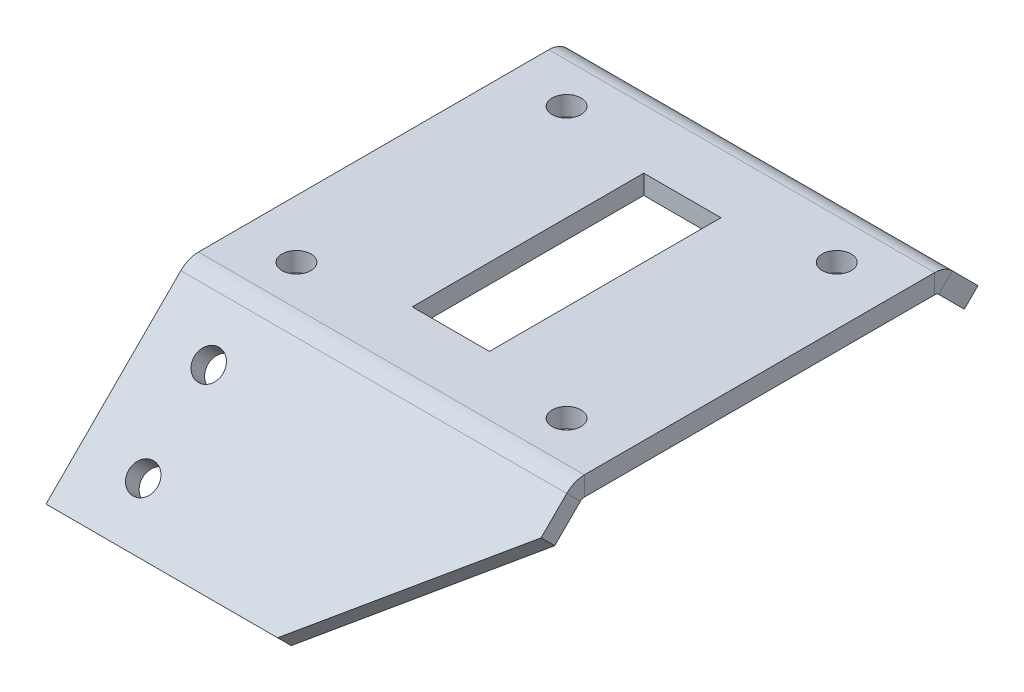
ISO-10303-21;
HEADER;
FILE_DESCRIPTION(('STEP AP214'),'2;1');
FILE_NAME('part.step','',(''),(''),'','','');
FILE_SCHEMA(('AUTOMOTIVE_DESIGN { 1 0 10303 214 1 1 1 1 }'));
ENDSEC;
DATA;
#1=APPLICATION_CONTEXT('core data for automotive mechanical design processes');
#2=APPLICATION_PROTOCOL_DEFINITION('international standard','automotive_design',2000,#1);
#3=PRODUCT_CONTEXT('',#1,'mechanical');
#4=PRODUCT('Part','Part','',(#3));
#5=PRODUCT_RELATED_PRODUCT_CATEGORY('part','',(#4));
#6=PRODUCT_DEFINITION_FORMATION('','',#4);
#7=PRODUCT_DEFINITION_CONTEXT('part definition',#1,'design');
#8=PRODUCT_DEFINITION('design','',#6,#7);
#9=PRODUCT_DEFINITION_SHAPE('','',#8);
#10=(LENGTH_UNIT() NAMED_UNIT(*) SI_UNIT(.MILLI.,.METRE.));
#11=(NAMED_UNIT(*) PLANE_ANGLE_UNIT() SI_UNIT($,.RADIAN.));
#12=(NAMED_UNIT(*) SI_UNIT($,.STERADIAN.) SOLID_ANGLE_UNIT());
#13=UNCERTAINTY_MEASURE_WITH_UNIT(LENGTH_MEASURE(1.E-05),#10,'distance_accuracy_value','');
#14=(GEOMETRIC_REPRESENTATION_CONTEXT(3) GLOBAL_UNCERTAINTY_ASSIGNED_CONTEXT((#13)) GLOBAL_UNIT_ASSIGNED_CONTEXT((#10,
#11,#12)) REPRESENTATION_CONTEXT('',''));
#15=CARTESIAN_POINT('',(0.,0.,0.));
#16=DIRECTION('',(0.,0.,1.));
#17=DIRECTION('',(1.,0.,0.));
#18=AXIS2_PLACEMENT_3D('',#15,#16,#17);
#19=CARTESIAN_POINT('',(50.,2.5,23.));
#20=DIRECTION('',(-1.,0.,0.));
#21=DIRECTION('',(0.,0.,1.));
#22=AXIS2_PLACEMENT_3D('',#19,#20,#21);
#23=PLANE('',#22);
#24=DIRECTION('',(0.,1.,0.));
#25=VECTOR('',#24,1.);
#26=CARTESIAN_POINT('',(50.,0.,22.694890289956));
#27=LINE('',#26,#25);
#28=CARTESIAN_POINT('',(50.,0.,22.694890289956));
#29=VERTEX_POINT('',#28);
#30=CARTESIAN_POINT('',(50.,2.5,22.694890289956));
#31=VERTEX_POINT('',#30);
#32=EDGE_CURVE('E300',#29,#31,#27,.T.);
#33=ORIENTED_EDGE('',*,*,#32,.F.);
#34=DIRECTION('',(0.,0.,-1.));
#35=VECTOR('',#34,1.);
#36=CARTESIAN_POINT('',(50.,0.,23.));
#37=LINE('',#36,#35);
#38=CARTESIAN_POINT('',(50.,0.,-22.694890289956));
#39=VERTEX_POINT('',#38);
#40=EDGE_CURVE('E355',#29,#39,#37,.T.);
#41=ORIENTED_EDGE('',*,*,#40,.T.);
#42=DIRECTION('',(0.,1.,0.));
#43=VECTOR('',#42,1.);
#44=CARTESIAN_POINT('',(50.,0.,-22.694890289956));
#45=LINE('',#44,#43);
#46=CARTESIAN_POINT('',(50.,2.5,-22.694890289956));
#47=VERTEX_POINT('',#46);
#48=EDGE_CURVE('E342',#39,#47,#45,.T.);
#49=ORIENTED_EDGE('',*,*,#48,.T.);
#50=DIRECTION('',(0.,0.,-1.));
#51=VECTOR('',#50,1.);
#52=CARTESIAN_POINT('',(50.,2.5,23.));
#53=LINE('',#52,#51);
#54=EDGE_CURVE('E358',#31,#47,#53,.T.);
#55=ORIENTED_EDGE('',*,*,#54,.F.);
#56=EDGE_LOOP('',(#33,#41,#49,#55));
#57=FACE_BOUND('',#56,.T.);
#58=ADVANCED_FACE('F45',(#57),#23,.F.);
#59=CARTESIAN_POINT('',(0.,2.5,23.));
#60=DIRECTION('',(1.,0.,0.));
#61=DIRECTION('',(0.,0.,-1.));
#62=AXIS2_PLACEMENT_3D('',#59,#60,#61);
#63=PLANE('',#62);
#64=DIRECTION('',(0.,1.,0.));
#65=VECTOR('',#64,1.);
#66=CARTESIAN_POINT('',(0.,0.,22.694890289956));
#67=LINE('',#66,#65);
#68=CARTESIAN_POINT('',(0.,0.,22.694890289956));
#69=VERTEX_POINT('',#68);
#70=CARTESIAN_POINT('',(0.,2.5,22.694890289956));
#71=VERTEX_POINT('',#70);
#72=EDGE_CURVE('E290',#69,#71,#67,.T.);
#73=ORIENTED_EDGE('',*,*,#72,.T.);
#74=DIRECTION('',(0.,0.,1.));
#75=VECTOR('',#74,1.);
#76=CARTESIAN_POINT('',(0.,2.5,23.));
#77=LINE('',#76,#75);
#78=CARTESIAN_POINT('',(0.,2.5,-22.694890289956));
#79=VERTEX_POINT('',#78);
#80=EDGE_CURVE('E361',#79,#71,#77,.T.);
#81=ORIENTED_EDGE('',*,*,#80,.F.);
#82=DIRECTION('',(0.,1.,0.));
#83=VECTOR('',#82,1.);
#84=CARTESIAN_POINT('',(0.,0.,-22.694890289956));
#85=LINE('',#84,#83);
#86=CARTESIAN_POINT('',(0.,0.,-22.694890289956));
#87=VERTEX_POINT('',#86);
#88=EDGE_CURVE('E352',#87,#79,#85,.T.);
#89=ORIENTED_EDGE('',*,*,#88,.F.);
#90=DIRECTION('',(0.,0.,1.));
#91=VECTOR('',#90,1.);
#92=CARTESIAN_POINT('',(0.,0.,23.));
#93=LINE('',#92,#91);
#94=EDGE_CURVE('E362',#87,#69,#93,.T.);
#95=ORIENTED_EDGE('',*,*,#94,.T.);
#96=EDGE_LOOP('',(#73,#81,#89,#95));
#97=FACE_BOUND('',#96,.T.);
#98=ADVANCED_FACE('F426',(#97),#63,.F.);
#99=CARTESIAN_POINT('',(0.,2.5,0.));
#100=DIRECTION('',(0.,1.,0.));
#101=DIRECTION('',(0.,0.,1.));
#102=AXIS2_PLACEMENT_3D('',#99,#100,#101);
#103=PLANE('',#102);
#104=DIRECTION('',(0.,0.,1.));
#105=VECTOR('',#104,1.);
#106=CARTESIAN_POINT('',(20.,2.5,-15.));
#107=LINE('',#106,#105);
#108=CARTESIAN_POINT('',(20.,2.5,-15.));
#109=VERTEX_POINT('',#108);
#110=CARTESIAN_POINT('',(20.,2.5,15.));
#111=VERTEX_POINT('',#110);
#112=EDGE_CURVE('E61',#109,#111,#107,.T.);
#113=ORIENTED_EDGE('',*,*,#112,.F.);
#114=DIRECTION('',(-1.,0.,0.));
#115=VECTOR('',#114,1.);
#116=CARTESIAN_POINT('',(20.,2.5,-15.));
#117=LINE('',#116,#115);
#118=CARTESIAN_POINT('',(30.,2.5,-15.));
#119=VERTEX_POINT('',#118);
#120=EDGE_CURVE('E178',#119,#109,#117,.T.);
#121=ORIENTED_EDGE('',*,*,#120,.F.);
#122=DIRECTION('',(0.,0.,-1.));
#123=VECTOR('',#122,1.);
#124=CARTESIAN_POINT('',(30.,2.5,-15.));
#125=LINE('',#124,#123);
#126=CARTESIAN_POINT('',(30.,2.5,15.));
#127=VERTEX_POINT('',#126);
#128=EDGE_CURVE('E198',#127,#119,#125,.T.);
#129=ORIENTED_EDGE('',*,*,#128,.F.);
#130=DIRECTION('',(1.,0.,0.));
#131=VECTOR('',#130,1.);
#132=CARTESIAN_POINT('',(20.,2.5,15.));
#133=LINE('',#132,#131);
#134=EDGE_CURVE('E192',#111,#127,#133,.T.);
#135=ORIENTED_EDGE('',*,*,#134,.F.);
#136=EDGE_LOOP('',(#113,#121,#129,#135));
#137=FACE_BOUND('',#136,.T.);
#138=CARTESIAN_POINT('',(42.5,2.5,-17.5));
#139=DIRECTION('',(0.,1.,0.));
#140=DIRECTION('',(0.,0.,1.));
#141=AXIS2_PLACEMENT_3D('',#138,#139,#140);
#142=CIRCLE('',#141,1.875);
#143=CARTESIAN_POINT('',(42.5,2.5,-15.625));
#144=VERTEX_POINT('',#143);
#145=EDGE_CURVE('E216',#144,#144,#142,.T.);
#146=ORIENTED_EDGE('',*,*,#145,.F.);
#147=EDGE_LOOP('',(#146));
#148=FACE_BOUND('',#147,.T.);
#149=CARTESIAN_POINT('',(7.5,2.5,17.5));
#150=DIRECTION('',(0.,1.,0.));
#151=DIRECTION('',(0.,0.,1.));
#152=AXIS2_PLACEMENT_3D('',#149,#150,#151);
#153=CIRCLE('',#152,1.875);
#154=CARTESIAN_POINT('',(7.5,2.5,19.375));
#155=VERTEX_POINT('',#154);
#156=EDGE_CURVE('E217',#155,#155,#153,.T.);
#157=ORIENTED_EDGE('',*,*,#156,.F.);
#158=EDGE_LOOP('',(#157));
#159=FACE_BOUND('',#158,.T.);
#160=CARTESIAN_POINT('',(42.5,2.5,17.5));
#161=DIRECTION('',(0.,1.,0.));
#162=DIRECTION('',(0.,0.,1.));
#163=AXIS2_PLACEMENT_3D('',#160,#161,#162);
#164=CIRCLE('',#163,1.875);
#165=CARTESIAN_POINT('',(42.5,2.5,19.375));
#166=VERTEX_POINT('',#165);
#167=EDGE_CURVE('E209',#166,#166,#164,.T.);
#168=ORIENTED_EDGE('',*,*,#167,.F.);
#169=EDGE_LOOP('',(#168));
#170=FACE_BOUND('',#169,.T.);
#171=CARTESIAN_POINT('',(7.5,2.5,-17.5));
#172=DIRECTION('',(0.,1.,0.));
#173=DIRECTION('',(0.,0.,1.));
#174=AXIS2_PLACEMENT_3D('',#171,#172,#173);
#175=CIRCLE('',#174,1.875);
#176=CARTESIAN_POINT('',(7.5,2.5,-15.625));
#177=VERTEX_POINT('',#176);
#178=EDGE_CURVE('E220',#177,#177,#175,.T.);
#179=ORIENTED_EDGE('',*,*,#178,.F.);
#180=EDGE_LOOP('',(#179));
#181=FACE_BOUND('',#180,.T.);
#182=ORIENTED_EDGE('',*,*,#80,.T.);
#183=DIRECTION('',(-1.,0.,0.));
#184=VECTOR('',#183,1.);
#185=CARTESIAN_POINT('',(0.,2.5,22.694890289956));
#186=LINE('',#185,#184);
#187=EDGE_CURVE('E283',#71,#31,#186,.F.);
#188=ORIENTED_EDGE('',*,*,#187,.T.);
#189=ORIENTED_EDGE('',*,*,#54,.T.);
#190=DIRECTION('',(1.,0.,0.));
#191=VECTOR('',#190,1.);
#192=CARTESIAN_POINT('',(50.,2.5,-22.694890289956));
#193=LINE('',#192,#191);
#194=EDGE_CURVE('E335',#47,#79,#193,.F.);
#195=ORIENTED_EDGE('',*,*,#194,.T.);
#196=EDGE_LOOP('',(#182,#188,#189,#195));
#197=FACE_BOUND('',#196,.T.);
#198=ADVANCED_FACE('F432',(#137,#148,#159,#170,#181,#197),#103,.T.);
#199=CARTESIAN_POINT('',(0.,0.,0.));
#200=DIRECTION('',(0.,1.,0.));
#201=DIRECTION('',(0.,0.,1.));
#202=AXIS2_PLACEMENT_3D('',#199,#200,#201);
#203=PLANE('',#202);
#204=DIRECTION('',(1.,0.,0.));
#205=VECTOR('',#204,1.);
#206=CARTESIAN_POINT('',(20.,0.,-15.));
#207=LINE('',#206,#205);
#208=CARTESIAN_POINT('',(20.,0.,-15.));
#209=VERTEX_POINT('',#208);
#210=CARTESIAN_POINT('',(30.,0.,-15.));
#211=VERTEX_POINT('',#210);
#212=EDGE_CURVE('E190',#209,#211,#207,.T.);
#213=ORIENTED_EDGE('',*,*,#212,.F.);
#214=DIRECTION('',(0.,0.,-1.));
#215=VECTOR('',#214,1.);
#216=CARTESIAN_POINT('',(20.,0.,-15.));
#217=LINE('',#216,#215);
#218=CARTESIAN_POINT('',(20.,0.,15.));
#219=VERTEX_POINT('',#218);
#220=EDGE_CURVE('E172',#219,#209,#217,.T.);
#221=ORIENTED_EDGE('',*,*,#220,.F.);
#222=DIRECTION('',(-1.,0.,0.));
#223=VECTOR('',#222,1.);
#224=CARTESIAN_POINT('',(20.,0.,15.));
#225=LINE('',#224,#223);
#226=CARTESIAN_POINT('',(30.,0.,15.));
#227=VERTEX_POINT('',#226);
#228=EDGE_CURVE('E181',#227,#219,#225,.T.);
#229=ORIENTED_EDGE('',*,*,#228,.F.);
#230=DIRECTION('',(0.,0.,1.));
#231=VECTOR('',#230,1.);
#232=CARTESIAN_POINT('',(30.,0.,-15.));
#233=LINE('',#232,#231);
#234=EDGE_CURVE('E69',#211,#227,#233,.T.);
#235=ORIENTED_EDGE('',*,*,#234,.F.);
#236=EDGE_LOOP('',(#213,#221,#229,#235));
#237=FACE_BOUND('',#236,.T.);
#238=CARTESIAN_POINT('',(42.5,0.,-17.5));
#239=DIRECTION('',(0.,1.,0.));
#240=DIRECTION('',(0.,0.,1.));
#241=AXIS2_PLACEMENT_3D('',#238,#239,#240);
#242=CIRCLE('',#241,1.875);
#243=CARTESIAN_POINT('',(42.5,0.,-15.625));
#244=VERTEX_POINT('',#243);
#245=EDGE_CURVE('E213',#244,#244,#242,.F.);
#246=ORIENTED_EDGE('',*,*,#245,.F.);
#247=EDGE_LOOP('',(#246));
#248=FACE_BOUND('',#247,.T.);
#249=CARTESIAN_POINT('',(7.5,0.,17.5));
#250=DIRECTION('',(0.,1.,0.));
#251=DIRECTION('',(0.,0.,1.));
#252=AXIS2_PLACEMENT_3D('',#249,#250,#251);
#253=CIRCLE('',#252,1.875);
#254=CARTESIAN_POINT('',(7.5,0.,19.375));
#255=VERTEX_POINT('',#254);
#256=EDGE_CURVE('E212',#255,#255,#253,.F.);
#257=ORIENTED_EDGE('',*,*,#256,.F.);
#258=EDGE_LOOP('',(#257));
#259=FACE_BOUND('',#258,.T.);
#260=CARTESIAN_POINT('',(42.5,0.,17.5));
#261=DIRECTION('',(0.,1.,0.));
#262=DIRECTION('',(0.,0.,1.));
#263=AXIS2_PLACEMENT_3D('',#260,#261,#262);
#264=CIRCLE('',#263,1.875);
#265=CARTESIAN_POINT('',(42.5,0.,19.375));
#266=VERTEX_POINT('',#265);
#267=EDGE_CURVE('E184',#266,#266,#264,.F.);
#268=ORIENTED_EDGE('',*,*,#267,.F.);
#269=EDGE_LOOP('',(#268));
#270=FACE_BOUND('',#269,.T.);
#271=CARTESIAN_POINT('',(7.5,0.,-17.5));
#272=DIRECTION('',(0.,1.,0.));
#273=DIRECTION('',(0.,0.,1.));
#274=AXIS2_PLACEMENT_3D('',#271,#272,#273);
#275=CIRCLE('',#274,1.875);
#276=CARTESIAN_POINT('',(7.5,0.,-15.625));
#277=VERTEX_POINT('',#276);
#278=EDGE_CURVE('E227',#277,#277,#275,.F.);
#279=ORIENTED_EDGE('',*,*,#278,.F.);
#280=EDGE_LOOP('',(#279));
#281=FACE_BOUND('',#280,.T.);
#282=DIRECTION('',(-1.,0.,0.));
#283=VECTOR('',#282,1.);
#284=CARTESIAN_POINT('',(0.,0.,22.694890289956));
#285=LINE('',#284,#283);
#286=EDGE_CURVE('E296',#69,#29,#285,.F.);
#287=ORIENTED_EDGE('',*,*,#286,.F.);
#288=ORIENTED_EDGE('',*,*,#94,.F.);
#289=DIRECTION('',(1.,0.,0.));
#290=VECTOR('',#289,1.);
#291=CARTESIAN_POINT('',(50.,0.,-22.694890289956));
#292=LINE('',#291,#290);
#293=EDGE_CURVE('E348',#39,#87,#292,.F.);
#294=ORIENTED_EDGE('',*,*,#293,.F.);
#295=ORIENTED_EDGE('',*,*,#40,.F.);
#296=EDGE_LOOP('',(#287,#288,#294,#295));
#297=FACE_BOUND('',#296,.T.);
#298=ADVANCED_FACE('F187',(#237,#248,#259,#270,#281,#297),#203,.F.);
#299=CARTESIAN_POINT('',(0.,-0.736599999999997,-22.694890289956));
#300=DIRECTION('',(-1.,0.,0.));
#301=DIRECTION('',(0.,-1.,0.));
#302=AXIS2_PLACEMENT_3D('',#299,#300,#301);
#303=PLANE('',#302);
#304=DIRECTION('',(0.,0.707106781186551,-0.707106781186544));
#305=VECTOR('',#304,1.);
#306=CARTESIAN_POINT('',(0.,-0.215745144977984,-23.215745144978));
#307=LINE('',#306,#305);
#308=CARTESIAN_POINT('',(0.,-0.215745144977986,-23.215745144978));
#309=VERTEX_POINT('',#308);
#310=CARTESIAN_POINT('',(0.,1.55202180798839,-24.9835120979443));
#311=VERTEX_POINT('',#310);
#312=EDGE_CURVE('E303',#309,#311,#307,.T.);
#313=ORIENTED_EDGE('',*,*,#312,.F.);
#314=CARTESIAN_POINT('',(0.,-0.736599999999997,-22.694890289956));
#315=DIRECTION('',(1.,0.,0.));
#316=DIRECTION('',(0.,1.,0.));
#317=AXIS2_PLACEMENT_3D('',#314,#315,#316);
#318=CIRCLE('',#317,0.736599999999996);
#319=EDGE_CURVE('E345',#87,#309,#318,.F.);
#320=ORIENTED_EDGE('',*,*,#319,.F.);
#321=ORIENTED_EDGE('',*,*,#88,.T.);
#322=CARTESIAN_POINT('',(0.,-0.736599999999997,-22.694890289956));
#323=DIRECTION('',(1.,0.,0.));
#324=DIRECTION('',(0.,1.,0.));
#325=AXIS2_PLACEMENT_3D('',#322,#323,#324);
#326=CIRCLE('',#325,3.2366);
#327=EDGE_CURVE('E338',#79,#311,#326,.F.);
#328=ORIENTED_EDGE('',*,*,#327,.T.);
#329=EDGE_LOOP('',(#313,#320,#321,#328));
#330=FACE_BOUND('',#329,.T.);
#331=ADVANCED_FACE('F488',(#330),#303,.T.);
#332=CARTESIAN_POINT('',(50.,-0.736600000000001,-22.694890289956));
#333=DIRECTION('',(-1.,0.,0.));
#334=DIRECTION('',(0.,-1.,0.));
#335=AXIS2_PLACEMENT_3D('',#332,#333,#334);
#336=PLANE('',#335);
#337=CARTESIAN_POINT('',(50.,-0.736600000000001,-22.694890289956));
#338=DIRECTION('',(1.,0.,0.));
#339=DIRECTION('',(0.,1.,0.));
#340=AXIS2_PLACEMENT_3D('',#337,#338,#339);
#341=CIRCLE('',#340,0.736599999999996);
#342=CARTESIAN_POINT('',(50.,-0.21574514497799,-23.215745144978));
#343=VERTEX_POINT('',#342);
#344=EDGE_CURVE('E334',#343,#39,#341,.T.);
#345=ORIENTED_EDGE('',*,*,#344,.F.);
#346=DIRECTION('',(0.,0.707106781186551,-0.707106781186544));
#347=VECTOR('',#346,1.);
#348=CARTESIAN_POINT('',(50.,-0.215745144977991,-23.215745144978));
#349=LINE('',#348,#347);
#350=CARTESIAN_POINT('',(50.,1.55202180798839,-24.9835120979443));
#351=VERTEX_POINT('',#350);
#352=EDGE_CURVE('E308',#343,#351,#349,.T.);
#353=ORIENTED_EDGE('',*,*,#352,.T.);
#354=CARTESIAN_POINT('',(50.,-0.736600000000001,-22.694890289956));
#355=DIRECTION('',(1.,0.,0.));
#356=DIRECTION('',(0.,1.,0.));
#357=AXIS2_PLACEMENT_3D('',#354,#355,#356);
#358=CIRCLE('',#357,3.2366);
#359=EDGE_CURVE('E339',#351,#47,#358,.T.);
#360=ORIENTED_EDGE('',*,*,#359,.T.);
#361=ORIENTED_EDGE('',*,*,#48,.F.);
#362=EDGE_LOOP('',(#345,#353,#360,#361));
#363=FACE_BOUND('',#362,.T.);
#364=ADVANCED_FACE('F480',(#363),#336,.F.);
#365=CARTESIAN_POINT('',(50.,-0.736600000000001,-22.694890289956));
#366=DIRECTION('',(1.,0.,0.));
#367=DIRECTION('',(0.,0.707106781186551,-0.707106781186544));
#368=AXIS2_PLACEMENT_3D('',#365,#366,#367);
#369=CYLINDRICAL_SURFACE('',#368,3.2366);
#370=ORIENTED_EDGE('',*,*,#194,.F.);
#371=ORIENTED_EDGE('',*,*,#359,.F.);
#372=DIRECTION('',(-1.,0.,0.));
#373=VECTOR('',#372,1.);
#374=CARTESIAN_POINT('',(0.,1.55202180798839,-24.9835120979443));
#375=LINE('',#374,#373);
#376=EDGE_CURVE('E311',#351,#311,#375,.T.);
#377=ORIENTED_EDGE('',*,*,#376,.T.);
#378=ORIENTED_EDGE('',*,*,#327,.F.);
#379=EDGE_LOOP('',(#370,#371,#377,#378));
#380=FACE_BOUND('',#379,.T.);
#381=ADVANCED_FACE('F489',(#380),#369,.T.);
#382=CARTESIAN_POINT('',(50.,-0.736600000000001,-22.694890289956));
#383=DIRECTION('',(1.,0.,0.));
#384=DIRECTION('',(0.,0.707106781186551,-0.707106781186544));
#385=AXIS2_PLACEMENT_3D('',#382,#383,#384);
#386=CYLINDRICAL_SURFACE('',#385,0.736599999999996);
#387=ORIENTED_EDGE('',*,*,#293,.T.);
#388=ORIENTED_EDGE('',*,*,#319,.T.);
#389=DIRECTION('',(1.,0.,0.));
#390=VECTOR('',#389,1.);
#391=CARTESIAN_POINT('',(0.,-0.215745144977984,-23.215745144978));
#392=LINE('',#391,#390);
#393=EDGE_CURVE('E306',#309,#343,#392,.T.);
#394=ORIENTED_EDGE('',*,*,#393,.T.);
#395=ORIENTED_EDGE('',*,*,#344,.T.);
#396=EDGE_LOOP('',(#387,#388,#394,#395));
#397=FACE_BOUND('',#396,.T.);
#398=ADVANCED_FACE('F477',(#397),#386,.F.);
#399=CARTESIAN_POINT('',(50.,-15.9099025766972,-42.4454364826302));
#400=DIRECTION('',(-1.,0.,0.));
#401=DIRECTION('',(0.,-1.,0.));
#402=AXIS2_PLACEMENT_3D('',#399,#400,#401);
#403=PLANE('',#402);
#404=DIRECTION('',(0.,-0.707106781186544,-0.707106781186551));
#405=VECTOR('',#404,1.);
#406=CARTESIAN_POINT('',(50.,-17.6776695296636,-40.6776695296638));
#407=LINE('',#406,#405);
#408=CARTESIAN_POINT('',(50.,-3.53553390593269,-26.5355339059327));
#409=VERTEX_POINT('',#408);
#410=EDGE_CURVE('E315',#343,#409,#407,.T.);
#411=ORIENTED_EDGE('',*,*,#410,.T.);
#412=DIRECTION('',(0.,0.707106781186551,-0.707106781186544));
#413=VECTOR('',#412,1.);
#414=CARTESIAN_POINT('',(50.,-1.76776695296631,-28.3033008588991));
#415=LINE('',#414,#413);
#416=CARTESIAN_POINT('',(50.,-1.76776695296631,-28.3033008588991));
#417=VERTEX_POINT('',#416);
#418=EDGE_CURVE('E374',#409,#417,#415,.T.);
#419=ORIENTED_EDGE('',*,*,#418,.T.);
#420=DIRECTION('',(0.,-0.707106781186544,-0.707106781186551));
#421=VECTOR('',#420,1.);
#422=CARTESIAN_POINT('',(50.,-15.9099025766972,-42.4454364826302));
#423=LINE('',#422,#421);
#424=EDGE_CURVE('E316',#351,#417,#423,.T.);
#425=ORIENTED_EDGE('',*,*,#424,.F.);
#426=ORIENTED_EDGE('',*,*,#352,.F.);
#427=EDGE_LOOP('',(#411,#419,#425,#426));
#428=FACE_BOUND('',#427,.T.);
#429=ADVANCED_FACE('F470',(#428),#403,.F.);
#430=CARTESIAN_POINT('',(0.,1.76776695296638,-24.7677669529664));
#431=DIRECTION('',(1.,0.,0.));
#432=DIRECTION('',(0.,0.,-1.));
#433=AXIS2_PLACEMENT_3D('',#430,#431,#432);
#434=PLANE('',#433);
#435=ORIENTED_EDGE('',*,*,#312,.T.);
#436=DIRECTION('',(0.,0.707106781186544,0.707106781186551));
#437=VECTOR('',#436,1.);
#438=CARTESIAN_POINT('',(0.,1.76776695296638,-24.7677669529664));
#439=LINE('',#438,#437);
#440=CARTESIAN_POINT('',(0.,-15.9099025766972,-42.4454364826301));
#441=VERTEX_POINT('',#440);
#442=EDGE_CURVE('E322',#441,#311,#439,.T.);
#443=ORIENTED_EDGE('',*,*,#442,.F.);
#444=DIRECTION('',(0.,-0.707106781186551,0.707106781186544));
#445=VECTOR('',#444,1.);
#446=CARTESIAN_POINT('',(0.,-15.9099025766972,-42.4454364826301));
#447=LINE('',#446,#445);
#448=CARTESIAN_POINT('',(0.,-17.6776695296636,-40.6776695296638));
#449=VERTEX_POINT('',#448);
#450=EDGE_CURVE('E325',#441,#449,#447,.T.);
#451=ORIENTED_EDGE('',*,*,#450,.T.);
#452=DIRECTION('',(0.,0.707106781186544,0.707106781186551));
#453=VECTOR('',#452,1.);
#454=CARTESIAN_POINT('',(0.,0.,-23.));
#455=LINE('',#454,#453);
#456=EDGE_CURVE('E320',#449,#309,#455,.T.);
#457=ORIENTED_EDGE('',*,*,#456,.T.);
#458=EDGE_LOOP('',(#435,#443,#451,#457));
#459=FACE_BOUND('',#458,.T.);
#460=ADVANCED_FACE('F466',(#459),#434,.F.);
#461=CARTESIAN_POINT('',(0.,13.2677669529664,-13.2677669529662));
#462=DIRECTION('',(0.,-0.707106781186551,0.707106781186544));
#463=DIRECTION('',(0.,-0.707106781186544,-0.707106781186551));
#464=AXIS2_PLACEMENT_3D('',#461,#462,#463);
#465=PLANE('',#464);
#466=CARTESIAN_POINT('',(8.00000000000001,-2.82842712474615,-29.3639610306789));
#467=DIRECTION('',(0.,-0.707106781186551,0.707106781186544));
#468=DIRECTION('',(0.,-0.707106781186544,-0.707106781186551));
#469=AXIS2_PLACEMENT_3D('',#466,#467,#468);
#470=CIRCLE('',#469,1.875);
#471=CARTESIAN_POINT('',(8.00000000000001,-4.15425233947092,-30.6897862454037));
#472=VERTEX_POINT('',#471);
#473=EDGE_CURVE('E231',#472,#472,#470,.T.);
#474=ORIENTED_EDGE('',*,*,#473,.T.);
#475=EDGE_LOOP('',(#474));
#476=FACE_BOUND('',#475,.T.);
#477=CARTESIAN_POINT('',(8.00000000000001,-11.3137084989847,-37.8492424049175));
#478=DIRECTION('',(0.,-0.707106781186551,0.707106781186544));
#479=DIRECTION('',(0.,-0.707106781186544,-0.707106781186551));
#480=AXIS2_PLACEMENT_3D('',#477,#478,#479);
#481=CIRCLE('',#480,1.875);
#482=CARTESIAN_POINT('',(8.00000000000001,-12.6395337137094,-39.1750676196423));
#483=VERTEX_POINT('',#482);
#484=EDGE_CURVE('E230',#483,#483,#481,.T.);
#485=ORIENTED_EDGE('',*,*,#484,.T.);
#486=EDGE_LOOP('',(#485));
#487=FACE_BOUND('',#486,.T.);
#488=ORIENTED_EDGE('',*,*,#424,.T.);
#489=DIRECTION('',(0.707106781186547,0.499999999999998,0.500000000000003));
#490=VECTOR('',#489,1.);
#491=CARTESIAN_POINT('',(30.,-15.9099025766972,-42.4454364826301));
#492=LINE('',#491,#490);
#493=CARTESIAN_POINT('',(30.,-15.9099025766972,-42.4454364826301));
#494=VERTEX_POINT('',#493);
#495=EDGE_CURVE('E376',#417,#494,#492,.F.);
#496=ORIENTED_EDGE('',*,*,#495,.T.);
#497=DIRECTION('',(-1.,0.,0.));
#498=VECTOR('',#497,1.);
#499=CARTESIAN_POINT('',(0.,-15.9099025766972,-42.4454364826301));
#500=LINE('',#499,#498);
#501=EDGE_CURVE('E319',#494,#441,#500,.T.);
#502=ORIENTED_EDGE('',*,*,#501,.T.);
#503=ORIENTED_EDGE('',*,*,#442,.T.);
#504=ORIENTED_EDGE('',*,*,#376,.F.);
#505=EDGE_LOOP('',(#488,#496,#502,#503,#504));
#506=FACE_BOUND('',#505,.T.);
#507=ADVANCED_FACE('F456',(#476,#487,#506),#465,.F.);
#508=CARTESIAN_POINT('',(0.,11.5,-11.4999999999999));
#509=DIRECTION('',(0.,-0.707106781186551,0.707106781186544));
#510=DIRECTION('',(0.,-0.707106781186544,-0.707106781186551));
#511=AXIS2_PLACEMENT_3D('',#508,#509,#510);
#512=PLANE('',#511);
#513=CARTESIAN_POINT('',(8.00000000000001,-4.59619407771253,-27.5961940777126));
#514=DIRECTION('',(0.,-0.707106781186551,0.707106781186544));
#515=DIRECTION('',(0.,-0.707106781186544,-0.707106781186551));
#516=AXIS2_PLACEMENT_3D('',#513,#514,#515);
#517=CIRCLE('',#516,1.875);
#518=CARTESIAN_POINT('',(8.00000000000001,-5.9220192924373,-28.9220192924374));
#519=VERTEX_POINT('',#518);
#520=EDGE_CURVE('E234',#519,#519,#517,.T.);
#521=ORIENTED_EDGE('',*,*,#520,.F.);
#522=EDGE_LOOP('',(#521));
#523=FACE_BOUND('',#522,.T.);
#524=CARTESIAN_POINT('',(8.00000000000001,-13.0814754519511,-36.0814754519512));
#525=DIRECTION('',(0.,-0.707106781186551,0.707106781186544));
#526=DIRECTION('',(0.,-0.707106781186544,-0.707106781186551));
#527=AXIS2_PLACEMENT_3D('',#524,#525,#526);
#528=CIRCLE('',#527,1.875);
#529=CARTESIAN_POINT('',(8.00000000000001,-14.4073006666758,-37.407300666676));
#530=VERTEX_POINT('',#529);
#531=EDGE_CURVE('E235',#530,#530,#528,.T.);
#532=ORIENTED_EDGE('',*,*,#531,.F.);
#533=EDGE_LOOP('',(#532));
#534=FACE_BOUND('',#533,.T.);
#535=DIRECTION('',(-1.,0.,0.));
#536=VECTOR('',#535,1.);
#537=CARTESIAN_POINT('',(0.,-17.6776695296636,-40.6776695296638));
#538=LINE('',#537,#536);
#539=CARTESIAN_POINT('',(30.,-17.6776695296636,-40.6776695296638));
#540=VERTEX_POINT('',#539);
#541=EDGE_CURVE('E328',#540,#449,#538,.T.);
#542=ORIENTED_EDGE('',*,*,#541,.F.);
#543=DIRECTION('',(-0.707106781186547,-0.499999999999998,-0.500000000000003));
#544=VECTOR('',#543,1.);
#545=CARTESIAN_POINT('',(35.6317279836454,-13.6954364826299,-36.6954364826301));
#546=LINE('',#545,#544);
#547=EDGE_CURVE('E372',#540,#409,#546,.F.);
#548=ORIENTED_EDGE('',*,*,#547,.T.);
#549=ORIENTED_EDGE('',*,*,#410,.F.);
#550=ORIENTED_EDGE('',*,*,#393,.F.);
#551=ORIENTED_EDGE('',*,*,#456,.F.);
#552=EDGE_LOOP('',(#542,#548,#549,#550,#551));
#553=FACE_BOUND('',#552,.T.);
#554=ADVANCED_FACE('F474',(#523,#534,#553),#512,.T.);
#555=CARTESIAN_POINT('',(0.,-15.9099025766972,-42.4454364826301));
#556=DIRECTION('',(0.,0.707106781186544,0.707106781186551));
#557=DIRECTION('',(0.,-0.707106781186551,0.707106781186544));
#558=AXIS2_PLACEMENT_3D('',#555,#556,#557);
#559=PLANE('',#558);
#560=ORIENTED_EDGE('',*,*,#501,.F.);
#561=DIRECTION('',(0.,-0.707106781186551,0.707106781186544));
#562=VECTOR('',#561,1.);
#563=CARTESIAN_POINT('',(30.,-15.9099025766972,-42.4454364826301));
#564=LINE('',#563,#562);
#565=EDGE_CURVE('E365',#494,#540,#564,.T.);
#566=ORIENTED_EDGE('',*,*,#565,.T.);
#567=ORIENTED_EDGE('',*,*,#541,.T.);
#568=ORIENTED_EDGE('',*,*,#450,.F.);
#569=EDGE_LOOP('',(#560,#566,#567,#568));
#570=FACE_BOUND('',#569,.T.);
#571=ADVANCED_FACE('F461',(#570),#559,.F.);
#572=CARTESIAN_POINT('',(50.,-0.736599999999999,22.694890289956));
#573=DIRECTION('',(1.,0.,0.));
#574=DIRECTION('',(0.,0.,-1.));
#575=AXIS2_PLACEMENT_3D('',#572,#573,#574);
#576=PLANE('',#575);
#577=DIRECTION('',(0.,0.707106781186551,0.707106781186544));
#578=VECTOR('',#577,1.);
#579=CARTESIAN_POINT('',(50.,-0.215745144977984,23.215745144978));
#580=LINE('',#579,#578);
#581=CARTESIAN_POINT('',(50.,-0.215745144977983,23.215745144978));
#582=VERTEX_POINT('',#581);
#583=CARTESIAN_POINT('',(50.,1.5520218079884,24.9835120979443));
#584=VERTEX_POINT('',#583);
#585=EDGE_CURVE('E246',#582,#584,#580,.T.);
#586=ORIENTED_EDGE('',*,*,#585,.F.);
#587=CARTESIAN_POINT('',(50.,-0.736599999999999,22.694890289956));
#588=DIRECTION('',(-1.,0.,0.));
#589=DIRECTION('',(0.,0.,1.));
#590=AXIS2_PLACEMENT_3D('',#587,#588,#589);
#591=CIRCLE('',#590,0.736600000000003);
#592=EDGE_CURVE('E293',#29,#582,#591,.F.);
#593=ORIENTED_EDGE('',*,*,#592,.F.);
#594=ORIENTED_EDGE('',*,*,#32,.T.);
#595=CARTESIAN_POINT('',(50.,-0.736599999999999,22.694890289956));
#596=DIRECTION('',(-1.,0.,0.));
#597=DIRECTION('',(0.,0.,1.));
#598=AXIS2_PLACEMENT_3D('',#595,#596,#597);
#599=CIRCLE('',#598,3.2366);
#600=EDGE_CURVE('E286',#31,#584,#599,.F.);
#601=ORIENTED_EDGE('',*,*,#600,.T.);
#602=EDGE_LOOP('',(#586,#593,#594,#601));
#603=FACE_BOUND('',#602,.T.);
#604=ADVANCED_FACE('F494',(#603),#576,.T.);
#605=CARTESIAN_POINT('',(0.,-0.736599999999999,22.694890289956));
#606=DIRECTION('',(1.,0.,0.));
#607=DIRECTION('',(0.,0.,-1.));
#608=AXIS2_PLACEMENT_3D('',#605,#606,#607);
#609=PLANE('',#608);
#610=CARTESIAN_POINT('',(0.,-0.736599999999999,22.694890289956));
#611=DIRECTION('',(-1.,0.,0.));
#612=DIRECTION('',(0.,0.,1.));
#613=AXIS2_PLACEMENT_3D('',#610,#611,#612);
#614=CIRCLE('',#613,0.736600000000003);
#615=CARTESIAN_POINT('',(0.,-0.215745144977983,23.215745144978));
#616=VERTEX_POINT('',#615);
#617=EDGE_CURVE('E282',#616,#69,#614,.T.);
#618=ORIENTED_EDGE('',*,*,#617,.F.);
#619=DIRECTION('',(0.,0.707106781186551,0.707106781186544));
#620=VECTOR('',#619,1.);
#621=CARTESIAN_POINT('',(0.,-0.215745144977984,23.215745144978));
#622=LINE('',#621,#620);
#623=CARTESIAN_POINT('',(0.,1.55202180798839,24.9835120979443));
#624=VERTEX_POINT('',#623);
#625=EDGE_CURVE('E257',#616,#624,#622,.T.);
#626=ORIENTED_EDGE('',*,*,#625,.T.);
#627=CARTESIAN_POINT('',(0.,-0.736599999999999,22.694890289956));
#628=DIRECTION('',(-1.,0.,0.));
#629=DIRECTION('',(0.,0.,1.));
#630=AXIS2_PLACEMENT_3D('',#627,#628,#629);
#631=CIRCLE('',#630,3.2366);
#632=EDGE_CURVE('E287',#624,#71,#631,.T.);
#633=ORIENTED_EDGE('',*,*,#632,.T.);
#634=ORIENTED_EDGE('',*,*,#72,.F.);
#635=EDGE_LOOP('',(#618,#626,#633,#634));
#636=FACE_BOUND('',#635,.T.);
#637=ADVANCED_FACE('F411',(#636),#609,.F.);
#638=CARTESIAN_POINT('',(0.,-0.736599999999999,22.694890289956));
#639=DIRECTION('',(-1.,0.,0.));
#640=DIRECTION('',(0.,0.707106781186551,0.707106781186544));
#641=AXIS2_PLACEMENT_3D('',#638,#639,#640);
#642=CYLINDRICAL_SURFACE('',#641,3.2366);
#643=ORIENTED_EDGE('',*,*,#187,.F.);
#644=ORIENTED_EDGE('',*,*,#632,.F.);
#645=DIRECTION('',(1.,0.,0.));
#646=VECTOR('',#645,1.);
#647=CARTESIAN_POINT('',(0.,1.55202180798839,24.9835120979443));
#648=LINE('',#647,#646);
#649=EDGE_CURVE('E260',#624,#584,#648,.T.);
#650=ORIENTED_EDGE('',*,*,#649,.T.);
#651=ORIENTED_EDGE('',*,*,#600,.F.);
#652=EDGE_LOOP('',(#643,#644,#650,#651));
#653=FACE_BOUND('',#652,.T.);
#654=ADVANCED_FACE('F421',(#653),#642,.T.);
#655=CARTESIAN_POINT('',(0.,-0.736599999999999,22.694890289956));
#656=DIRECTION('',(-1.,0.,0.));
#657=DIRECTION('',(0.,0.707106781186551,0.707106781186544));
#658=AXIS2_PLACEMENT_3D('',#655,#656,#657);
#659=CYLINDRICAL_SURFACE('',#658,0.736600000000003);
#660=ORIENTED_EDGE('',*,*,#286,.T.);
#661=ORIENTED_EDGE('',*,*,#592,.T.);
#662=DIRECTION('',(-1.,0.,0.));
#663=VECTOR('',#662,1.);
#664=CARTESIAN_POINT('',(50.,-0.215745144977984,23.215745144978));
#665=LINE('',#664,#663);
#666=EDGE_CURVE('E255',#582,#616,#665,.T.);
#667=ORIENTED_EDGE('',*,*,#666,.T.);
#668=ORIENTED_EDGE('',*,*,#617,.T.);
#669=EDGE_LOOP('',(#660,#661,#667,#668));
#670=FACE_BOUND('',#669,.T.);
#671=ADVANCED_FACE('F406',(#670),#659,.F.);
#672=CARTESIAN_POINT('',(0.,-15.9099025766972,42.4454364826301));
#673=DIRECTION('',(1.,0.,0.));
#674=DIRECTION('',(0.,0.,-1.));
#675=AXIS2_PLACEMENT_3D('',#672,#673,#674);
#676=PLANE('',#675);
#677=ORIENTED_EDGE('',*,*,#625,.F.);
#678=DIRECTION('',(0.,-0.707106781186544,0.707106781186551));
#679=VECTOR('',#678,1.);
#680=CARTESIAN_POINT('',(0.,-17.6776695296636,40.6776695296638));
#681=LINE('',#680,#679);
#682=CARTESIAN_POINT('',(0.,-17.6776695296636,40.6776695296638));
#683=VERTEX_POINT('',#682);
#684=EDGE_CURVE('E265',#616,#683,#681,.T.);
#685=ORIENTED_EDGE('',*,*,#684,.T.);
#686=DIRECTION('',(0.,-0.707106781186551,-0.707106781186544));
#687=VECTOR('',#686,1.);
#688=CARTESIAN_POINT('',(0.,-15.9099025766972,42.4454364826301));
#689=LINE('',#688,#687);
#690=CARTESIAN_POINT('',(0.,-15.9099025766972,42.4454364826301));
#691=VERTEX_POINT('',#690);
#692=EDGE_CURVE('E274',#691,#683,#689,.T.);
#693=ORIENTED_EDGE('',*,*,#692,.F.);
#694=DIRECTION('',(0.,-0.707106781186544,0.707106781186551));
#695=VECTOR('',#694,1.);
#696=CARTESIAN_POINT('',(0.,-15.9099025766972,42.4454364826301));
#697=LINE('',#696,#695);
#698=EDGE_CURVE('E266',#624,#691,#697,.T.);
#699=ORIENTED_EDGE('',*,*,#698,.F.);
#700=EDGE_LOOP('',(#677,#685,#693,#699));
#701=FACE_BOUND('',#700,.T.);
#702=ADVANCED_FACE('F413',(#701),#676,.F.);
#703=CARTESIAN_POINT('',(50.,1.76776695296638,24.7677669529664));
#704=DIRECTION('',(-1.,0.,0.));
#705=DIRECTION('',(0.,0.,1.));
#706=AXIS2_PLACEMENT_3D('',#703,#704,#705);
#707=PLANE('',#706);
#708=DIRECTION('',(0.,0.707106781186544,-0.707106781186551));
#709=VECTOR('',#708,1.);
#710=CARTESIAN_POINT('',(50.,1.76776695296638,24.7677669529664));
#711=LINE('',#710,#709);
#712=CARTESIAN_POINT('',(50.,-1.76776695296635,28.3033008588991));
#713=VERTEX_POINT('',#712);
#714=EDGE_CURVE('E272',#713,#584,#711,.T.);
#715=ORIENTED_EDGE('',*,*,#714,.F.);
#716=DIRECTION('',(0.,-0.707106781186551,-0.707106781186544));
#717=VECTOR('',#716,1.);
#718=CARTESIAN_POINT('',(50.,-1.76776695296634,28.3033008588991));
#719=LINE('',#718,#717);
#720=CARTESIAN_POINT('',(50.,-3.53553390593272,26.5355339059328));
#721=VERTEX_POINT('',#720);
#722=EDGE_CURVE('E378',#713,#721,#719,.T.);
#723=ORIENTED_EDGE('',*,*,#722,.T.);
#724=DIRECTION('',(0.,0.707106781186544,-0.707106781186551));
#725=VECTOR('',#724,1.);
#726=CARTESIAN_POINT('',(50.,0.,23.));
#727=LINE('',#726,#725);
#728=EDGE_CURVE('E269',#721,#582,#727,.T.);
#729=ORIENTED_EDGE('',*,*,#728,.T.);
#730=ORIENTED_EDGE('',*,*,#585,.T.);
#731=EDGE_LOOP('',(#715,#723,#729,#730));
#732=FACE_BOUND('',#731,.T.);
#733=ADVANCED_FACE('F398',(#732),#707,.F.);
#734=CARTESIAN_POINT('',(0.,13.2677669529664,13.2677669529662));
#735=DIRECTION('',(0.,-0.707106781186551,-0.707106781186544));
#736=DIRECTION('',(0.,0.707106781186544,-0.707106781186551));
#737=AXIS2_PLACEMENT_3D('',#734,#735,#736);
#738=PLANE('',#737);
#739=CARTESIAN_POINT('',(8.00000000000001,-2.82842712474615,29.3639610306789));
#740=DIRECTION('',(0.,0.707106781186551,0.707106781186544));
#741=DIRECTION('',(0.,-0.707106781186544,0.707106781186551));
#742=AXIS2_PLACEMENT_3D('',#739,#740,#741);
#743=CIRCLE('',#742,1.875);
#744=CARTESIAN_POINT('',(8.00000000000001,-4.15425233947092,30.6897862454037));
#745=VERTEX_POINT('',#744);
#746=EDGE_CURVE('E243',#745,#745,#743,.T.);
#747=ORIENTED_EDGE('',*,*,#746,.F.);
#748=EDGE_LOOP('',(#747));
#749=FACE_BOUND('',#748,.T.);
#750=CARTESIAN_POINT('',(8.00000000000001,-11.3137084989847,37.8492424049175));
#751=DIRECTION('',(0.,0.707106781186551,0.707106781186544));
#752=DIRECTION('',(0.,-0.707106781186544,0.707106781186551));
#753=AXIS2_PLACEMENT_3D('',#750,#751,#752);
#754=CIRCLE('',#753,1.875);
#755=CARTESIAN_POINT('',(8.00000000000001,-12.6395337137094,39.1750676196423));
#756=VERTEX_POINT('',#755);
#757=EDGE_CURVE('E238',#756,#756,#754,.T.);
#758=ORIENTED_EDGE('',*,*,#757,.F.);
#759=EDGE_LOOP('',(#758));
#760=FACE_BOUND('',#759,.T.);
#761=DIRECTION('',(1.,0.,0.));
#762=VECTOR('',#761,1.);
#763=CARTESIAN_POINT('',(50.,-15.9099025766972,42.4454364826301));
#764=LINE('',#763,#762);
#765=CARTESIAN_POINT('',(29.9999999999999,-15.9099025766972,42.4454364826301));
#766=VERTEX_POINT('',#765);
#767=EDGE_CURVE('E268',#691,#766,#764,.T.);
#768=ORIENTED_EDGE('',*,*,#767,.T.);
#769=DIRECTION('',(-0.707106781186549,-0.499999999999996,0.500000000000002));
#770=VECTOR('',#769,1.);
#771=CARTESIAN_POINT('',(50.,-1.76776695296635,28.3033008588991));
#772=LINE('',#771,#770);
#773=EDGE_CURVE('E11',#766,#713,#772,.F.);
#774=ORIENTED_EDGE('',*,*,#773,.T.);
#775=ORIENTED_EDGE('',*,*,#714,.T.);
#776=ORIENTED_EDGE('',*,*,#649,.F.);
#777=ORIENTED_EDGE('',*,*,#698,.T.);
#778=EDGE_LOOP('',(#768,#774,#775,#776,#777));
#779=FACE_BOUND('',#778,.T.);
#780=ADVANCED_FACE('F391',(#749,#760,#779),#738,.F.);
#781=CARTESIAN_POINT('',(0.,11.5,11.4999999999999));
#782=DIRECTION('',(0.,-0.707106781186551,-0.707106781186544));
#783=DIRECTION('',(0.,0.707106781186544,-0.707106781186551));
#784=AXIS2_PLACEMENT_3D('',#781,#782,#783);
#785=PLANE('',#784);
#786=CARTESIAN_POINT('',(8.00000000000001,-4.59619407771253,27.5961940777126));
#787=DIRECTION('',(0.,-0.707106781186551,-0.707106781186544));
#788=DIRECTION('',(0.,0.707106781186544,-0.707106781186551));
#789=AXIS2_PLACEMENT_3D('',#786,#787,#788);
#790=CIRCLE('',#789,1.875);
#791=CARTESIAN_POINT('',(8.00000000000001,-3.27036886298776,26.2703688629878));
#792=VERTEX_POINT('',#791);
#793=EDGE_CURVE('E247',#792,#792,#790,.F.);
#794=ORIENTED_EDGE('',*,*,#793,.T.);
#795=EDGE_LOOP('',(#794));
#796=FACE_BOUND('',#795,.T.);
#797=CARTESIAN_POINT('',(8.00000000000001,-13.0814754519511,36.0814754519512));
#798=DIRECTION('',(0.,-0.707106781186551,-0.707106781186544));
#799=DIRECTION('',(0.,0.707106781186544,-0.707106781186551));
#800=AXIS2_PLACEMENT_3D('',#797,#798,#799);
#801=CIRCLE('',#800,1.875);
#802=CARTESIAN_POINT('',(8.00000000000001,-11.7556502372263,34.7556502372264));
#803=VERTEX_POINT('',#802);
#804=EDGE_CURVE('E250',#803,#803,#801,.F.);
#805=ORIENTED_EDGE('',*,*,#804,.T.);
#806=EDGE_LOOP('',(#805));
#807=FACE_BOUND('',#806,.T.);
#808=ORIENTED_EDGE('',*,*,#728,.F.);
#809=DIRECTION('',(0.707106781186549,0.499999999999996,-0.500000000000002));
#810=VECTOR('',#809,1.);
#811=CARTESIAN_POINT('',(35.6317279836452,-13.69543648263,36.6954364826301));
#812=LINE('',#811,#810);
#813=CARTESIAN_POINT('',(29.9999999999999,-17.6776695296636,40.6776695296638));
#814=VERTEX_POINT('',#813);
#815=EDGE_CURVE('E381',#721,#814,#812,.F.);
#816=ORIENTED_EDGE('',*,*,#815,.T.);
#817=DIRECTION('',(1.,0.,0.));
#818=VECTOR('',#817,1.);
#819=CARTESIAN_POINT('',(50.,-17.6776695296636,40.6776695296638));
#820=LINE('',#819,#818);
#821=EDGE_CURVE('E276',#683,#814,#820,.T.);
#822=ORIENTED_EDGE('',*,*,#821,.F.);
#823=ORIENTED_EDGE('',*,*,#684,.F.);
#824=ORIENTED_EDGE('',*,*,#666,.F.);
#825=EDGE_LOOP('',(#808,#816,#822,#823,#824));
#826=FACE_BOUND('',#825,.T.);
#827=ADVANCED_FACE('F402',(#796,#807,#826),#785,.T.);
#828=CARTESIAN_POINT('',(50.,-15.9099025766972,42.4454364826301));
#829=DIRECTION('',(0.,0.707106781186544,-0.707106781186551));
#830=DIRECTION('',(0.,0.707106781186551,0.707106781186544));
#831=AXIS2_PLACEMENT_3D('',#828,#829,#830);
#832=PLANE('',#831);
#833=ORIENTED_EDGE('',*,*,#821,.T.);
#834=DIRECTION('',(0.,0.707106781186551,0.707106781186544));
#835=VECTOR('',#834,1.);
#836=CARTESIAN_POINT('',(29.9999999999999,-15.9099025766972,42.4454364826301));
#837=LINE('',#836,#835);
#838=EDGE_CURVE('E54',#814,#766,#837,.T.);
#839=ORIENTED_EDGE('',*,*,#838,.T.);
#840=ORIENTED_EDGE('',*,*,#767,.F.);
#841=ORIENTED_EDGE('',*,*,#692,.T.);
#842=EDGE_LOOP('',(#833,#839,#840,#841));
#843=FACE_BOUND('',#842,.T.);
#844=ADVANCED_FACE('F385',(#843),#832,.F.);
#845=CARTESIAN_POINT('',(8.00000000000001,-54.644028458098,-5.48107755419533));
#846=DIRECTION('',(0.,0.707106781186551,0.707106781186544));
#847=DIRECTION('',(0.,-0.707106781186544,0.707106781186551));
#848=AXIS2_PLACEMENT_3D('',#845,#846,#847);
#849=CYLINDRICAL_SURFACE('',#848,1.875);
#850=ORIENTED_EDGE('',*,*,#804,.F.);
#851=EDGE_LOOP('',(#850));
#852=FACE_BOUND('',#851,.T.);
#853=ORIENTED_EDGE('',*,*,#757,.T.);
#854=EDGE_LOOP('',(#853));
#855=FACE_BOUND('',#854,.T.);
#856=ADVANCED_FACE('F606',(#852,#855),#849,.F.);
#857=CARTESIAN_POINT('',(8.00000000000001,-46.1587470838595,-13.9663589284339));
#858=DIRECTION('',(0.,0.707106781186551,0.707106781186544));
#859=DIRECTION('',(0.,-0.707106781186544,0.707106781186551));
#860=AXIS2_PLACEMENT_3D('',#857,#858,#859);
#861=CYLINDRICAL_SURFACE('',#860,1.875);
#862=ORIENTED_EDGE('',*,*,#793,.F.);
#863=EDGE_LOOP('',(#862));
#864=FACE_BOUND('',#863,.T.);
#865=ORIENTED_EDGE('',*,*,#746,.T.);
#866=EDGE_LOOP('',(#865));
#867=FACE_BOUND('',#866,.T.);
#868=ADVANCED_FACE('F749',(#864,#867),#861,.F.);
#869=CARTESIAN_POINT('',(8.00000000000001,-54.644028458098,5.48107755419533));
#870=DIRECTION('',(0.,0.707106781186551,-0.707106781186544));
#871=DIRECTION('',(0.,0.707106781186544,0.707106781186551));
#872=AXIS2_PLACEMENT_3D('',#869,#870,#871);
#873=CYLINDRICAL_SURFACE('',#872,1.875);
#874=ORIENTED_EDGE('',*,*,#531,.T.);
#875=EDGE_LOOP('',(#874));
#876=FACE_BOUND('',#875,.T.);
#877=ORIENTED_EDGE('',*,*,#484,.F.);
#878=EDGE_LOOP('',(#877));
#879=FACE_BOUND('',#878,.T.);
#880=ADVANCED_FACE('F761',(#876,#879),#873,.F.);
#881=CARTESIAN_POINT('',(8.00000000000001,-46.1587470838595,13.9663589284339));
#882=DIRECTION('',(0.,0.707106781186551,-0.707106781186544));
#883=DIRECTION('',(0.,0.707106781186544,0.707106781186551));
#884=AXIS2_PLACEMENT_3D('',#881,#882,#883);
#885=CYLINDRICAL_SURFACE('',#884,1.875);
#886=ORIENTED_EDGE('',*,*,#520,.T.);
#887=EDGE_LOOP('',(#886));
#888=FACE_BOUND('',#887,.T.);
#889=ORIENTED_EDGE('',*,*,#473,.F.);
#890=EDGE_LOOP('',(#889));
#891=FACE_BOUND('',#890,.T.);
#892=ADVANCED_FACE('F773',(#888,#891),#885,.F.);
#893=CARTESIAN_POINT('',(7.5,-17.6786695296636,-17.5));
#894=DIRECTION('',(0.,1.,0.));
#895=DIRECTION('',(0.,0.,1.));
#896=AXIS2_PLACEMENT_3D('',#893,#894,#895);
#897=CYLINDRICAL_SURFACE('',#896,1.875);
#898=ORIENTED_EDGE('',*,*,#178,.T.);
#899=EDGE_LOOP('',(#898));
#900=FACE_BOUND('',#899,.T.);
#901=ORIENTED_EDGE('',*,*,#278,.T.);
#902=EDGE_LOOP('',(#901));
#903=FACE_BOUND('',#902,.T.);
#904=ADVANCED_FACE('F785',(#900,#903),#897,.F.);
#905=CARTESIAN_POINT('',(42.5,-17.6786695296636,17.5));
#906=DIRECTION('',(0.,1.,0.));
#907=DIRECTION('',(0.,0.,1.));
#908=AXIS2_PLACEMENT_3D('',#905,#906,#907);
#909=CYLINDRICAL_SURFACE('',#908,1.875);
#910=ORIENTED_EDGE('',*,*,#167,.T.);
#911=EDGE_LOOP('',(#910));
#912=FACE_BOUND('',#911,.T.);
#913=ORIENTED_EDGE('',*,*,#267,.T.);
#914=EDGE_LOOP('',(#913));
#915=FACE_BOUND('',#914,.T.);
#916=ADVANCED_FACE('F797',(#912,#915),#909,.F.);
#917=CARTESIAN_POINT('',(7.5,-17.6786695296636,17.5));
#918=DIRECTION('',(0.,1.,0.));
#919=DIRECTION('',(0.,0.,1.));
#920=AXIS2_PLACEMENT_3D('',#917,#918,#919);
#921=CYLINDRICAL_SURFACE('',#920,1.875);
#922=ORIENTED_EDGE('',*,*,#156,.T.);
#923=EDGE_LOOP('',(#922));
#924=FACE_BOUND('',#923,.T.);
#925=ORIENTED_EDGE('',*,*,#256,.T.);
#926=EDGE_LOOP('',(#925));
#927=FACE_BOUND('',#926,.T.);
#928=ADVANCED_FACE('F448',(#924,#927),#921,.F.);
#929=CARTESIAN_POINT('',(42.5,-17.6786695296636,-17.5));
#930=DIRECTION('',(0.,1.,0.));
#931=DIRECTION('',(0.,0.,1.));
#932=AXIS2_PLACEMENT_3D('',#929,#930,#931);
#933=CYLINDRICAL_SURFACE('',#932,1.875);
#934=ORIENTED_EDGE('',*,*,#145,.T.);
#935=EDGE_LOOP('',(#934));
#936=FACE_BOUND('',#935,.T.);
#937=ORIENTED_EDGE('',*,*,#245,.T.);
#938=EDGE_LOOP('',(#937));
#939=FACE_BOUND('',#938,.T.);
#940=ADVANCED_FACE('F442',(#936,#939),#933,.F.);
#941=CARTESIAN_POINT('',(30.,-15.9099025766972,-42.4454364826301));
#942=DIRECTION('',(-0.707106781186548,0.499999999999997,0.500000000000002));
#943=DIRECTION('',(0.,-0.707106781186551,0.707106781186544));
#944=AXIS2_PLACEMENT_3D('',#941,#942,#943);
#945=PLANE('',#944);
#946=ORIENTED_EDGE('',*,*,#495,.F.);
#947=ORIENTED_EDGE('',*,*,#418,.F.);
#948=ORIENTED_EDGE('',*,*,#547,.F.);
#949=ORIENTED_EDGE('',*,*,#565,.F.);
#950=EDGE_LOOP('',(#946,#947,#948,#949));
#951=FACE_BOUND('',#950,.T.);
#952=ADVANCED_FACE('F438',(#951),#945,.F.);
#953=CARTESIAN_POINT('',(50.,-1.76776695296635,28.3033008588991));
#954=DIRECTION('',(-0.707106781186546,0.499999999999998,-0.500000000000004));
#955=DIRECTION('',(0.,-0.707106781186551,-0.707106781186544));
#956=AXIS2_PLACEMENT_3D('',#953,#954,#955);
#957=PLANE('',#956);
#958=ORIENTED_EDGE('',*,*,#773,.F.);
#959=ORIENTED_EDGE('',*,*,#838,.F.);
#960=ORIENTED_EDGE('',*,*,#815,.F.);
#961=ORIENTED_EDGE('',*,*,#722,.F.);
#962=EDGE_LOOP('',(#958,#959,#960,#961));
#963=FACE_BOUND('',#962,.T.);
#964=ADVANCED_FACE('F48',(#963),#957,.F.);
#965=CARTESIAN_POINT('',(20.,-17.6786695296636,-15.));
#966=DIRECTION('',(-1.,0.,0.));
#967=DIRECTION('',(0.,0.,1.));
#968=AXIS2_PLACEMENT_3D('',#965,#966,#967);
#969=PLANE('',#968);
#970=ORIENTED_EDGE('',*,*,#220,.T.);
#971=DIRECTION('',(0.,1.,0.));
#972=VECTOR('',#971,1.);
#973=CARTESIAN_POINT('',(20.,-17.6786695296636,-15.));
#974=LINE('',#973,#972);
#975=EDGE_CURVE('E185',#209,#109,#974,.T.);
#976=ORIENTED_EDGE('',*,*,#975,.T.);
#977=ORIENTED_EDGE('',*,*,#112,.T.);
#978=DIRECTION('',(0.,1.,0.));
#979=VECTOR('',#978,1.);
#980=CARTESIAN_POINT('',(20.,-17.6786695296636,15.));
#981=LINE('',#980,#979);
#982=EDGE_CURVE('E168',#219,#111,#981,.T.);
#983=ORIENTED_EDGE('',*,*,#982,.F.);
#984=EDGE_LOOP('',(#970,#976,#977,#983));
#985=FACE_BOUND('',#984,.T.);
#986=ADVANCED_FACE('F170',(#985),#969,.F.);
#987=CARTESIAN_POINT('',(20.,-17.6786695296636,-15.));
#988=DIRECTION('',(0.,0.,-1.));
#989=DIRECTION('',(-1.,0.,0.));
#990=AXIS2_PLACEMENT_3D('',#987,#988,#989);
#991=PLANE('',#990);
#992=ORIENTED_EDGE('',*,*,#212,.T.);
#993=DIRECTION('',(0.,1.,0.));
#994=VECTOR('',#993,1.);
#995=CARTESIAN_POINT('',(30.,-17.6786695296636,-15.));
#996=LINE('',#995,#994);
#997=EDGE_CURVE('E204',#211,#119,#996,.T.);
#998=ORIENTED_EDGE('',*,*,#997,.T.);
#999=ORIENTED_EDGE('',*,*,#120,.T.);
#1000=ORIENTED_EDGE('',*,*,#975,.F.);
#1001=EDGE_LOOP('',(#992,#998,#999,#1000));
#1002=FACE_BOUND('',#1001,.T.);
#1003=ADVANCED_FACE('F837',(#1002),#991,.F.);
#1004=CARTESIAN_POINT('',(30.,-17.6786695296636,-15.));
#1005=DIRECTION('',(1.,0.,0.));
#1006=DIRECTION('',(0.,0.,-1.));
#1007=AXIS2_PLACEMENT_3D('',#1004,#1005,#1006);
#1008=PLANE('',#1007);
#1009=ORIENTED_EDGE('',*,*,#234,.T.);
#1010=DIRECTION('',(0.,1.,0.));
#1011=VECTOR('',#1010,1.);
#1012=CARTESIAN_POINT('',(30.,-17.6786695296636,15.));
#1013=LINE('',#1012,#1011);
#1014=EDGE_CURVE('E177',#227,#127,#1013,.T.);
#1015=ORIENTED_EDGE('',*,*,#1014,.T.);
#1016=ORIENTED_EDGE('',*,*,#128,.T.);
#1017=ORIENTED_EDGE('',*,*,#997,.F.);
#1018=EDGE_LOOP('',(#1009,#1015,#1016,#1017));
#1019=FACE_BOUND('',#1018,.T.);
#1020=ADVANCED_FACE('F847',(#1019),#1008,.F.);
#1021=CARTESIAN_POINT('',(20.,-17.6786695296636,15.));
#1022=DIRECTION('',(0.,0.,1.));
#1023=DIRECTION('',(1.,0.,0.));
#1024=AXIS2_PLACEMENT_3D('',#1021,#1022,#1023);
#1025=PLANE('',#1024);
#1026=ORIENTED_EDGE('',*,*,#228,.T.);
#1027=ORIENTED_EDGE('',*,*,#982,.T.);
#1028=ORIENTED_EDGE('',*,*,#134,.T.);
#1029=ORIENTED_EDGE('',*,*,#1014,.F.);
#1030=EDGE_LOOP('',(#1026,#1027,#1028,#1029));
#1031=FACE_BOUND('',#1030,.T.);
#1032=ADVANCED_FACE('F182',(#1031),#1025,.F.);
#1033=CLOSED_SHELL('',(#58,#98,#198,#298,#331,#364,#381,#398,#429,#460,#507,#554,#571,#604,#637,
#654,#671,#702,#733,#780,#827,#844,#856,#868,#880,#892,#904,#916,#928,#940,#952,#964,#986,#1003,
#1020,#1032));
#1034=MANIFOLD_SOLID_BREP('B2',#1033);
#1035=ADVANCED_BREP_SHAPE_REPRESENTATION('',(#18,#1034),#14);
#1036=SHAPE_DEFINITION_REPRESENTATION(#9,#1035);
ENDSEC;
END-ISO-10303-21;
